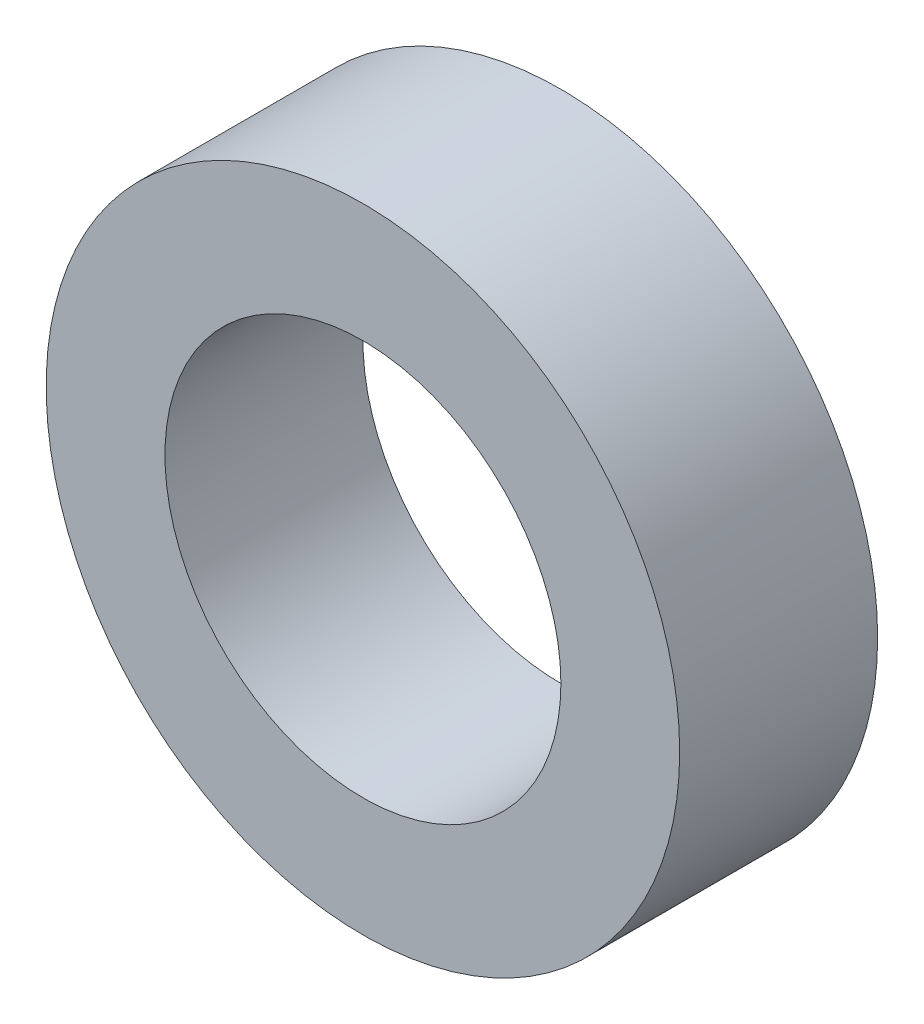
ISO-10303-21;
HEADER;
FILE_DESCRIPTION(('STEP AP214'),'2;1');
FILE_NAME('part.step','',(''),(''),'','','');
FILE_SCHEMA(('AUTOMOTIVE_DESIGN { 1 0 10303 214 1 1 1 1 }'));
ENDSEC;
DATA;
#1=APPLICATION_CONTEXT('core data for automotive mechanical design processes');
#2=APPLICATION_PROTOCOL_DEFINITION('international standard','automotive_design',2000,#1);
#3=PRODUCT_CONTEXT('',#1,'mechanical');
#4=PRODUCT('Part','Part','',(#3));
#5=PRODUCT_RELATED_PRODUCT_CATEGORY('part','',(#4));
#6=PRODUCT_DEFINITION_FORMATION('','',#4);
#7=PRODUCT_DEFINITION_CONTEXT('part definition',#1,'design');
#8=PRODUCT_DEFINITION('design','',#6,#7);
#9=PRODUCT_DEFINITION_SHAPE('','',#8);
#10=(LENGTH_UNIT() NAMED_UNIT(*) SI_UNIT(.MILLI.,.METRE.));
#11=(NAMED_UNIT(*) PLANE_ANGLE_UNIT() SI_UNIT($,.RADIAN.));
#12=(NAMED_UNIT(*) SI_UNIT($,.STERADIAN.) SOLID_ANGLE_UNIT());
#13=UNCERTAINTY_MEASURE_WITH_UNIT(LENGTH_MEASURE(1.E-05),#10,'distance_accuracy_value','');
#14=(GEOMETRIC_REPRESENTATION_CONTEXT(3) GLOBAL_UNCERTAINTY_ASSIGNED_CONTEXT((#13)) GLOBAL_UNIT_ASSIGNED_CONTEXT((#10,
#11,#12)) REPRESENTATION_CONTEXT('',''));
#15=CARTESIAN_POINT('',(0.,0.,0.));
#16=DIRECTION('',(0.,0.,1.));
#17=DIRECTION('',(1.,0.,0.));
#18=AXIS2_PLACEMENT_3D('',#15,#16,#17);
#19=CARTESIAN_POINT('',(0.,0.,-2.5));
#20=DIRECTION('',(0.,0.,1.));
#21=DIRECTION('',(1.,0.,0.));
#22=AXIS2_PLACEMENT_3D('',#19,#20,#21);
#23=CYLINDRICAL_SURFACE('',#22,4.);
#24=CARTESIAN_POINT('',(0.,0.,-2.5));
#25=DIRECTION('',(0.,0.,1.));
#26=DIRECTION('',(1.,0.,0.));
#27=AXIS2_PLACEMENT_3D('',#24,#25,#26);
#28=CIRCLE('',#27,4.);
#29=CARTESIAN_POINT('',(4.,0.,-2.5));
#30=VERTEX_POINT('',#29);
#31=EDGE_CURVE('E10',#30,#30,#28,.T.);
#32=ORIENTED_EDGE('',*,*,#31,.T.);
#33=EDGE_LOOP('',(#32));
#34=FACE_BOUND('',#33,.T.);
#35=CARTESIAN_POINT('',(0.,0.,0.));
#36=DIRECTION('',(0.,0.,1.));
#37=DIRECTION('',(1.,0.,0.));
#38=AXIS2_PLACEMENT_3D('',#35,#36,#37);
#39=CIRCLE('',#38,4.);
#40=CARTESIAN_POINT('',(4.,0.,0.));
#41=VERTEX_POINT('',#40);
#42=EDGE_CURVE('E44',#41,#41,#39,.T.);
#43=ORIENTED_EDGE('',*,*,#42,.F.);
#44=EDGE_LOOP('',(#43));
#45=FACE_BOUND('',#44,.T.);
#46=ADVANCED_FACE('F41',(#34,#45),#23,.T.);
#47=CARTESIAN_POINT('',(0.,0.,-2.5));
#48=DIRECTION('',(0.,0.,1.));
#49=DIRECTION('',(1.,0.,0.));
#50=AXIS2_PLACEMENT_3D('',#47,#48,#49);
#51=PLANE('',#50);
#52=CARTESIAN_POINT('',(0.,0.,-2.5));
#53=DIRECTION('',(0.,0.,1.));
#54=DIRECTION('',(1.,0.,0.));
#55=AXIS2_PLACEMENT_3D('',#52,#53,#54);
#56=CIRCLE('',#55,2.5);
#57=CARTESIAN_POINT('',(2.5,0.,-2.5));
#58=VERTEX_POINT('',#57);
#59=EDGE_CURVE('E53',#58,#58,#56,.T.);
#60=ORIENTED_EDGE('',*,*,#59,.T.);
#61=EDGE_LOOP('',(#60));
#62=FACE_BOUND('',#61,.T.);
#63=ORIENTED_EDGE('',*,*,#31,.F.);
#64=EDGE_LOOP('',(#63));
#65=FACE_BOUND('',#64,.T.);
#66=ADVANCED_FACE('F63',(#62,#65),#51,.F.);
#67=CARTESIAN_POINT('',(0.,0.,0.));
#68=DIRECTION('',(0.,0.,1.));
#69=DIRECTION('',(1.,0.,0.));
#70=AXIS2_PLACEMENT_3D('',#67,#68,#69);
#71=PLANE('',#70);
#72=CARTESIAN_POINT('',(0.,0.,0.));
#73=DIRECTION('',(0.,0.,1.));
#74=DIRECTION('',(1.,0.,0.));
#75=AXIS2_PLACEMENT_3D('',#72,#73,#74);
#76=CIRCLE('',#75,2.5);
#77=CARTESIAN_POINT('',(2.5,0.,0.));
#78=VERTEX_POINT('',#77);
#79=EDGE_CURVE('E55',#78,#78,#76,.T.);
#80=ORIENTED_EDGE('',*,*,#79,.F.);
#81=EDGE_LOOP('',(#80));
#82=FACE_BOUND('',#81,.T.);
#83=ORIENTED_EDGE('',*,*,#42,.T.);
#84=EDGE_LOOP('',(#83));
#85=FACE_BOUND('',#84,.T.);
#86=ADVANCED_FACE('F69',(#82,#85),#71,.T.);
#87=CARTESIAN_POINT('',(0.,0.,-2.5));
#88=DIRECTION('',(0.,0.,1.));
#89=DIRECTION('',(1.,0.,0.));
#90=AXIS2_PLACEMENT_3D('',#87,#88,#89);
#91=CYLINDRICAL_SURFACE('',#90,2.5);
#92=ORIENTED_EDGE('',*,*,#59,.F.);
#93=EDGE_LOOP('',(#92));
#94=FACE_BOUND('',#93,.T.);
#95=ORIENTED_EDGE('',*,*,#79,.T.);
#96=EDGE_LOOP('',(#95));
#97=FACE_BOUND('',#96,.T.);
#98=ADVANCED_FACE('F66',(#94,#97),#91,.F.);
#99=CLOSED_SHELL('',(#46,#66,#86,#98));
#100=MANIFOLD_SOLID_BREP('B2',#99);
#101=ADVANCED_BREP_SHAPE_REPRESENTATION('',(#18,#100),#14);
#102=SHAPE_DEFINITION_REPRESENTATION(#9,#101);
ENDSEC;
END-ISO-10303-21;
